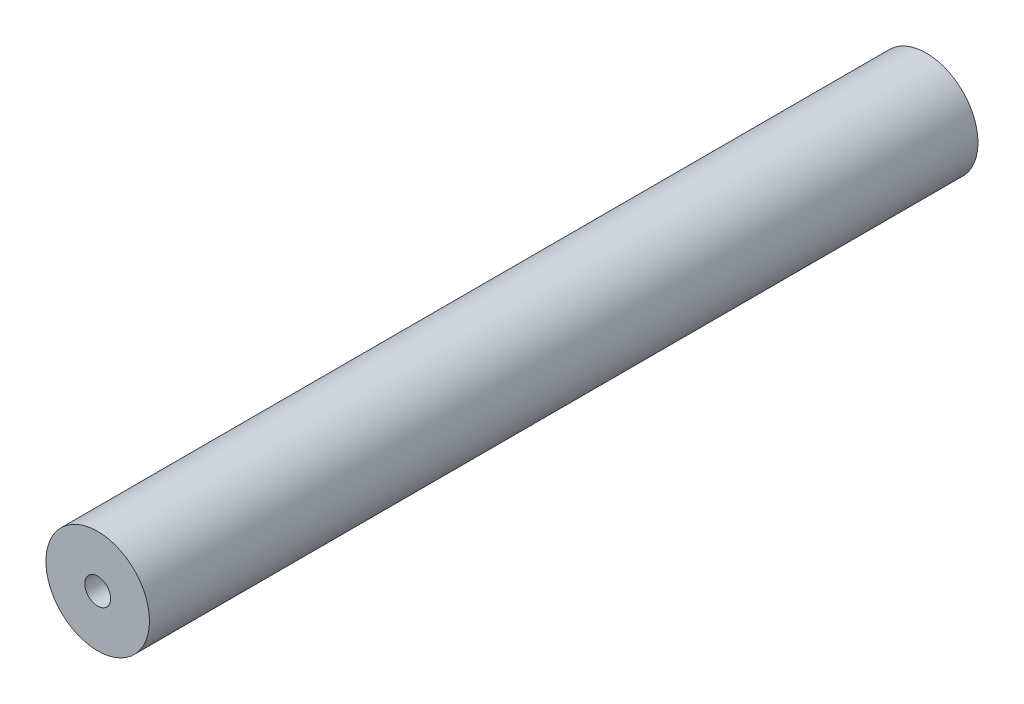
ISO-10303-21;
HEADER;
FILE_DESCRIPTION(('STEP AP214'),'2;1');
FILE_NAME('part.step','',(''),(''),'','','');
FILE_SCHEMA(('AUTOMOTIVE_DESIGN { 1 0 10303 214 1 1 1 1 }'));
ENDSEC;
DATA;
#1=APPLICATION_CONTEXT('core data for automotive mechanical design processes');
#2=APPLICATION_PROTOCOL_DEFINITION('international standard','automotive_design',2000,#1);
#3=PRODUCT_CONTEXT('',#1,'mechanical');
#4=PRODUCT('Part','Part','',(#3));
#5=PRODUCT_RELATED_PRODUCT_CATEGORY('part','',(#4));
#6=PRODUCT_DEFINITION_FORMATION('','',#4);
#7=PRODUCT_DEFINITION_CONTEXT('part definition',#1,'design');
#8=PRODUCT_DEFINITION('design','',#6,#7);
#9=PRODUCT_DEFINITION_SHAPE('','',#8);
#10=(LENGTH_UNIT() NAMED_UNIT(*) SI_UNIT(.MILLI.,.METRE.));
#11=(NAMED_UNIT(*) PLANE_ANGLE_UNIT() SI_UNIT($,.RADIAN.));
#12=(NAMED_UNIT(*) SI_UNIT($,.STERADIAN.) SOLID_ANGLE_UNIT());
#13=UNCERTAINTY_MEASURE_WITH_UNIT(LENGTH_MEASURE(1.E-05),#10,'distance_accuracy_value','');
#14=(GEOMETRIC_REPRESENTATION_CONTEXT(3) GLOBAL_UNCERTAINTY_ASSIGNED_CONTEXT((#13)) GLOBAL_UNIT_ASSIGNED_CONTEXT((#10,
#11,#12)) REPRESENTATION_CONTEXT('',''));
#15=CARTESIAN_POINT('',(0.,0.,0.));
#16=DIRECTION('',(0.,0.,1.));
#17=DIRECTION('',(1.,0.,0.));
#18=AXIS2_PLACEMENT_3D('',#15,#16,#17);
#19=CARTESIAN_POINT('',(0.,0.,320.));
#20=DIRECTION('',(0.,0.,-1.));
#21=DIRECTION('',(-1.,0.,0.));
#22=AXIS2_PLACEMENT_3D('',#19,#20,#21);
#23=CYLINDRICAL_SURFACE('',#22,20.);
#24=CARTESIAN_POINT('',(0.,0.,320.));
#25=DIRECTION('',(0.,0.,1.));
#26=DIRECTION('',(1.,0.,0.));
#27=AXIS2_PLACEMENT_3D('',#24,#25,#26);
#28=CIRCLE('',#27,20.);
#29=CARTESIAN_POINT('',(20.,0.,320.));
#30=VERTEX_POINT('',#29);
#31=EDGE_CURVE('E12',#30,#30,#28,.T.);
#32=ORIENTED_EDGE('',*,*,#31,.F.);
#33=EDGE_LOOP('',(#32));
#34=FACE_BOUND('',#33,.T.);
#35=CARTESIAN_POINT('',(0.,0.,0.));
#36=DIRECTION('',(0.,0.,1.));
#37=DIRECTION('',(1.,0.,0.));
#38=AXIS2_PLACEMENT_3D('',#35,#36,#37);
#39=CIRCLE('',#38,20.);
#40=CARTESIAN_POINT('',(20.,0.,0.));
#41=VERTEX_POINT('',#40);
#42=EDGE_CURVE('E45',#41,#41,#39,.T.);
#43=ORIENTED_EDGE('',*,*,#42,.T.);
#44=EDGE_LOOP('',(#43));
#45=FACE_BOUND('',#44,.T.);
#46=ADVANCED_FACE('F42',(#34,#45),#23,.T.);
#47=CARTESIAN_POINT('',(0.,0.,320.));
#48=DIRECTION('',(0.,0.,1.));
#49=DIRECTION('',(1.,0.,0.));
#50=AXIS2_PLACEMENT_3D('',#47,#48,#49);
#51=PLANE('',#50);
#52=CARTESIAN_POINT('',(0.,0.,320.));
#53=DIRECTION('',(0.,0.,1.));
#54=DIRECTION('',(1.,0.,0.));
#55=AXIS2_PLACEMENT_3D('',#52,#53,#54);
#56=CIRCLE('',#55,5.);
#57=CARTESIAN_POINT('',(5.,0.,320.));
#58=VERTEX_POINT('',#57);
#59=EDGE_CURVE('E54',#58,#58,#56,.T.);
#60=ORIENTED_EDGE('',*,*,#59,.F.);
#61=EDGE_LOOP('',(#60));
#62=FACE_BOUND('',#61,.T.);
#63=ORIENTED_EDGE('',*,*,#31,.T.);
#64=EDGE_LOOP('',(#63));
#65=FACE_BOUND('',#64,.T.);
#66=ADVANCED_FACE('F69',(#62,#65),#51,.T.);
#67=CARTESIAN_POINT('',(0.,0.,0.));
#68=DIRECTION('',(0.,0.,1.));
#69=DIRECTION('',(1.,0.,0.));
#70=AXIS2_PLACEMENT_3D('',#67,#68,#69);
#71=PLANE('',#70);
#72=CARTESIAN_POINT('',(0.,0.,0.));
#73=DIRECTION('',(0.,0.,1.));
#74=DIRECTION('',(1.,0.,0.));
#75=AXIS2_PLACEMENT_3D('',#72,#73,#74);
#76=CIRCLE('',#75,5.);
#77=CARTESIAN_POINT('',(5.,0.,0.));
#78=VERTEX_POINT('',#77);
#79=EDGE_CURVE('E52',#78,#78,#76,.T.);
#80=ORIENTED_EDGE('',*,*,#79,.T.);
#81=EDGE_LOOP('',(#80));
#82=FACE_BOUND('',#81,.T.);
#83=ORIENTED_EDGE('',*,*,#42,.F.);
#84=EDGE_LOOP('',(#83));
#85=FACE_BOUND('',#84,.T.);
#86=ADVANCED_FACE('F60',(#82,#85),#71,.F.);
#87=CARTESIAN_POINT('',(0.,0.,0.));
#88=DIRECTION('',(0.,0.,1.));
#89=DIRECTION('',(1.,0.,0.));
#90=AXIS2_PLACEMENT_3D('',#87,#88,#89);
#91=CYLINDRICAL_SURFACE('',#90,5.);
#92=ORIENTED_EDGE('',*,*,#79,.F.);
#93=EDGE_LOOP('',(#92));
#94=FACE_BOUND('',#93,.T.);
#95=ORIENTED_EDGE('',*,*,#59,.T.);
#96=EDGE_LOOP('',(#95));
#97=FACE_BOUND('',#96,.T.);
#98=ADVANCED_FACE('F63',(#94,#97),#91,.F.);
#99=CLOSED_SHELL('',(#46,#66,#86,#98));
#100=MANIFOLD_SOLID_BREP('B2',#99);
#101=ADVANCED_BREP_SHAPE_REPRESENTATION('',(#18,#100),#14);
#102=SHAPE_DEFINITION_REPRESENTATION(#9,#101);
ENDSEC;
END-ISO-10303-21;
